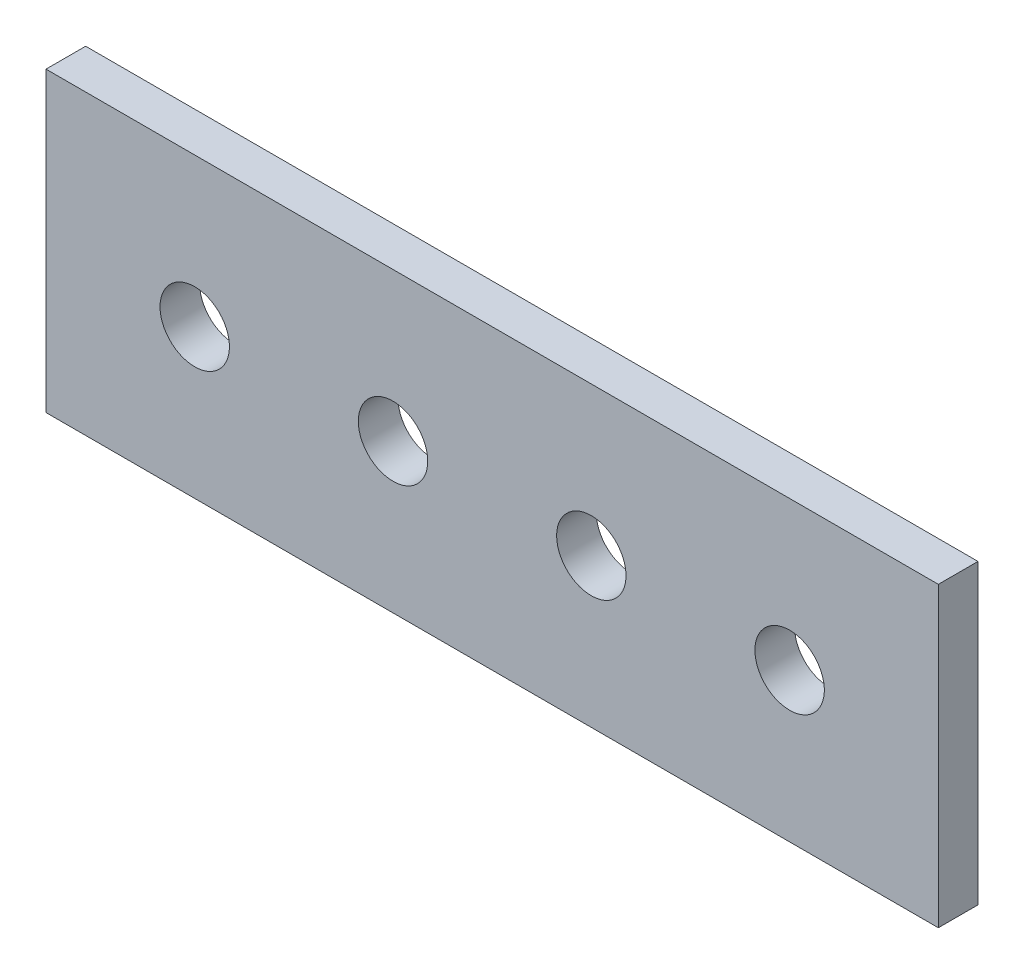
ISO-10303-21;
HEADER;
FILE_DESCRIPTION(('STEP AP214'),'2;1');
FILE_NAME('part.step','',(''),(''),'','','');
FILE_SCHEMA(('AUTOMOTIVE_DESIGN { 1 0 10303 214 1 1 1 1 }'));
ENDSEC;
DATA;
#1=APPLICATION_CONTEXT('core data for automotive mechanical design processes');
#2=APPLICATION_PROTOCOL_DEFINITION('international standard','automotive_design',2000,#1);
#3=PRODUCT_CONTEXT('',#1,'mechanical');
#4=PRODUCT('Part','Part','',(#3));
#5=PRODUCT_RELATED_PRODUCT_CATEGORY('part','',(#4));
#6=PRODUCT_DEFINITION_FORMATION('','',#4);
#7=PRODUCT_DEFINITION_CONTEXT('part definition',#1,'design');
#8=PRODUCT_DEFINITION('design','',#6,#7);
#9=PRODUCT_DEFINITION_SHAPE('','',#8);
#10=(LENGTH_UNIT() NAMED_UNIT(*) SI_UNIT(.MILLI.,.METRE.));
#11=(NAMED_UNIT(*) PLANE_ANGLE_UNIT() SI_UNIT($,.RADIAN.));
#12=(NAMED_UNIT(*) SI_UNIT($,.STERADIAN.) SOLID_ANGLE_UNIT());
#13=UNCERTAINTY_MEASURE_WITH_UNIT(LENGTH_MEASURE(1.E-05),#10,'distance_accuracy_value','');
#14=(GEOMETRIC_REPRESENTATION_CONTEXT(3) GLOBAL_UNCERTAINTY_ASSIGNED_CONTEXT((#13)) GLOBAL_UNIT_ASSIGNED_CONTEXT((#10,
#11,#12)) REPRESENTATION_CONTEXT('',''));
#15=CARTESIAN_POINT('',(0.,0.,0.));
#16=DIRECTION('',(0.,0.,1.));
#17=DIRECTION('',(1.,0.,0.));
#18=AXIS2_PLACEMENT_3D('',#15,#16,#17);
#19=CARTESIAN_POINT('',(-65.1327433628319,0.,-44.0132743362832));
#20=DIRECTION('',(-1.,0.,0.));
#21=DIRECTION('',(0.,0.,1.));
#22=AXIS2_PLACEMENT_3D('',#19,#20,#21);
#23=PLANE('',#22);
#24=DIRECTION('',(0.,-1.,0.));
#25=VECTOR('',#24,1.);
#26=CARTESIAN_POINT('',(-65.1327433628319,0.,-42.0132743362832));
#27=LINE('',#26,#25);
#28=CARTESIAN_POINT('',(-65.1327433628319,47.1391179720463,-42.0132743362832));
#29=VERTEX_POINT('',#28);
#30=CARTESIAN_POINT('',(-65.1327433628319,32.1391179720463,-42.0132743362832));
#31=VERTEX_POINT('',#30);
#32=EDGE_CURVE('E123',#29,#31,#27,.T.);
#33=ORIENTED_EDGE('',*,*,#32,.F.);
#34=DIRECTION('',(0.,0.,1.));
#35=VECTOR('',#34,1.);
#36=CARTESIAN_POINT('',(-65.1327433628319,47.1391179720463,-44.0132743362832));
#37=LINE('',#36,#35);
#38=CARTESIAN_POINT('',(-65.1327433628319,47.1391179720463,-44.0132743362832));
#39=VERTEX_POINT('',#38);
#40=EDGE_CURVE('E11',#39,#29,#37,.T.);
#41=ORIENTED_EDGE('',*,*,#40,.F.);
#42=DIRECTION('',(0.,-1.,0.));
#43=VECTOR('',#42,1.);
#44=CARTESIAN_POINT('',(-65.1327433628319,0.,-44.0132743362832));
#45=LINE('',#44,#43);
#46=CARTESIAN_POINT('',(-65.1327433628319,32.1391179720463,-44.0132743362832));
#47=VERTEX_POINT('',#46);
#48=EDGE_CURVE('E104',#39,#47,#45,.T.);
#49=ORIENTED_EDGE('',*,*,#48,.T.);
#50=DIRECTION('',(0.,0.,1.));
#51=VECTOR('',#50,1.);
#52=CARTESIAN_POINT('',(-65.1327433628319,32.1391179720463,-44.0132743362832));
#53=LINE('',#52,#51);
#54=EDGE_CURVE('E83',#47,#31,#53,.T.);
#55=ORIENTED_EDGE('',*,*,#54,.T.);
#56=EDGE_LOOP('',(#33,#41,#49,#55));
#57=FACE_BOUND('',#56,.T.);
#58=ADVANCED_FACE('F43',(#57),#23,.T.);
#59=CARTESIAN_POINT('',(0.,47.1391179720463,-44.0132743362832));
#60=DIRECTION('',(0.,1.,0.));
#61=DIRECTION('',(0.,0.,1.));
#62=AXIS2_PLACEMENT_3D('',#59,#60,#61);
#63=PLANE('',#62);
#64=DIRECTION('',(-1.,0.,0.));
#65=VECTOR('',#64,1.);
#66=CARTESIAN_POINT('',(0.,47.1391179720463,-42.0132743362832));
#67=LINE('',#66,#65);
#68=CARTESIAN_POINT('',(-20.1327433628319,47.1391179720463,-42.0132743362832));
#69=VERTEX_POINT('',#68);
#70=EDGE_CURVE('E95',#69,#29,#67,.T.);
#71=ORIENTED_EDGE('',*,*,#70,.F.);
#72=DIRECTION('',(0.,0.,1.));
#73=VECTOR('',#72,1.);
#74=CARTESIAN_POINT('',(-20.1327433628319,47.1391179720463,-44.0132743362832));
#75=LINE('',#74,#73);
#76=CARTESIAN_POINT('',(-20.1327433628319,47.1391179720463,-44.0132743362832));
#77=VERTEX_POINT('',#76);
#78=EDGE_CURVE('E52',#77,#69,#75,.T.);
#79=ORIENTED_EDGE('',*,*,#78,.F.);
#80=DIRECTION('',(-1.,0.,0.));
#81=VECTOR('',#80,1.);
#82=CARTESIAN_POINT('',(0.,47.1391179720463,-44.0132743362832));
#83=LINE('',#82,#81);
#84=EDGE_CURVE('E93',#77,#39,#83,.T.);
#85=ORIENTED_EDGE('',*,*,#84,.T.);
#86=ORIENTED_EDGE('',*,*,#40,.T.);
#87=EDGE_LOOP('',(#71,#79,#85,#86));
#88=FACE_BOUND('',#87,.T.);
#89=ADVANCED_FACE('F91',(#88),#63,.T.);
#90=CARTESIAN_POINT('',(-20.1327433628319,0.,-44.0132743362832));
#91=DIRECTION('',(-1.,0.,0.));
#92=DIRECTION('',(0.,-1.,0.));
#93=AXIS2_PLACEMENT_3D('',#90,#91,#92);
#94=PLANE('',#93);
#95=DIRECTION('',(0.,-1.,0.));
#96=VECTOR('',#95,1.);
#97=CARTESIAN_POINT('',(-20.1327433628319,0.,-42.0132743362832));
#98=LINE('',#97,#96);
#99=CARTESIAN_POINT('',(-20.1327433628319,32.1391179720463,-42.0132743362832));
#100=VERTEX_POINT('',#99);
#101=EDGE_CURVE('E126',#69,#100,#98,.T.);
#102=ORIENTED_EDGE('',*,*,#101,.T.);
#103=DIRECTION('',(0.,0.,1.));
#104=VECTOR('',#103,1.);
#105=CARTESIAN_POINT('',(-20.1327433628319,32.1391179720463,-44.0132743362832));
#106=LINE('',#105,#104);
#107=CARTESIAN_POINT('',(-20.1327433628319,32.1391179720463,-44.0132743362832));
#108=VERTEX_POINT('',#107);
#109=EDGE_CURVE('E98',#108,#100,#106,.T.);
#110=ORIENTED_EDGE('',*,*,#109,.F.);
#111=DIRECTION('',(0.,-1.,0.));
#112=VECTOR('',#111,1.);
#113=CARTESIAN_POINT('',(-20.1327433628319,0.,-44.0132743362832));
#114=LINE('',#113,#112);
#115=EDGE_CURVE('E100',#77,#108,#114,.T.);
#116=ORIENTED_EDGE('',*,*,#115,.F.);
#117=ORIENTED_EDGE('',*,*,#78,.T.);
#118=EDGE_LOOP('',(#102,#110,#116,#117));
#119=FACE_BOUND('',#118,.T.);
#120=ADVANCED_FACE('F101',(#119),#94,.F.);
#121=CARTESIAN_POINT('',(-27.6327433628319,39.6391179720463,-44.0132743362832));
#122=DIRECTION('',(0.,0.,1.));
#123=DIRECTION('',(1.,0.,0.));
#124=AXIS2_PLACEMENT_3D('',#121,#122,#123);
#125=CYLINDRICAL_SURFACE('',#124,1.75);
#126=CARTESIAN_POINT('',(-27.6327433628319,39.6391179720463,-44.0132743362832));
#127=DIRECTION('',(0.,0.,-1.));
#128=DIRECTION('',(-1.,0.,0.));
#129=AXIS2_PLACEMENT_3D('',#126,#127,#128);
#130=CIRCLE('',#129,1.75);
#131=CARTESIAN_POINT('',(-29.3827433628319,39.6391179720463,-44.0132743362832));
#132=VERTEX_POINT('',#131);
#133=EDGE_CURVE('E106',#132,#132,#130,.T.);
#134=ORIENTED_EDGE('',*,*,#133,.T.);
#135=EDGE_LOOP('',(#134));
#136=FACE_BOUND('',#135,.T.);
#137=CARTESIAN_POINT('',(-27.6327433628319,39.6391179720463,-42.0132743362832));
#138=DIRECTION('',(0.,0.,-1.));
#139=DIRECTION('',(-1.,0.,0.));
#140=AXIS2_PLACEMENT_3D('',#137,#138,#139);
#141=CIRCLE('',#140,1.75);
#142=CARTESIAN_POINT('',(-29.3827433628319,39.6391179720463,-42.0132743362832));
#143=VERTEX_POINT('',#142);
#144=EDGE_CURVE('E120',#143,#143,#141,.T.);
#145=ORIENTED_EDGE('',*,*,#144,.F.);
#146=EDGE_LOOP('',(#145));
#147=FACE_BOUND('',#146,.T.);
#148=ADVANCED_FACE('F143',(#136,#147),#125,.F.);
#149=CARTESIAN_POINT('',(-47.6327433628319,39.6391179720463,-44.0132743362832));
#150=DIRECTION('',(0.,0.,1.));
#151=DIRECTION('',(1.,0.,0.));
#152=AXIS2_PLACEMENT_3D('',#149,#150,#151);
#153=CYLINDRICAL_SURFACE('',#152,1.75);
#154=CARTESIAN_POINT('',(-47.6327433628319,39.6391179720463,-44.0132743362832));
#155=DIRECTION('',(0.,0.,-1.));
#156=DIRECTION('',(-1.,0.,0.));
#157=AXIS2_PLACEMENT_3D('',#154,#155,#156);
#158=CIRCLE('',#157,1.75);
#159=CARTESIAN_POINT('',(-49.3827433628319,39.6391179720463,-44.0132743362832));
#160=VERTEX_POINT('',#159);
#161=EDGE_CURVE('E242',#160,#160,#158,.T.);
#162=ORIENTED_EDGE('',*,*,#161,.T.);
#163=EDGE_LOOP('',(#162));
#164=FACE_BOUND('',#163,.T.);
#165=CARTESIAN_POINT('',(-47.6327433628319,39.6391179720463,-42.0132743362832));
#166=DIRECTION('',(0.,0.,-1.));
#167=DIRECTION('',(-1.,0.,0.));
#168=AXIS2_PLACEMENT_3D('',#165,#166,#167);
#169=CIRCLE('',#168,1.75);
#170=CARTESIAN_POINT('',(-49.3827433628319,39.6391179720463,-42.0132743362832));
#171=VERTEX_POINT('',#170);
#172=EDGE_CURVE('E117',#171,#171,#169,.T.);
#173=ORIENTED_EDGE('',*,*,#172,.F.);
#174=EDGE_LOOP('',(#173));
#175=FACE_BOUND('',#174,.T.);
#176=ADVANCED_FACE('F146',(#164,#175),#153,.F.);
#177=CARTESIAN_POINT('',(-57.6327433628319,39.6391179720463,-44.0132743362832));
#178=DIRECTION('',(0.,0.,1.));
#179=DIRECTION('',(1.,0.,0.));
#180=AXIS2_PLACEMENT_3D('',#177,#178,#179);
#181=CYLINDRICAL_SURFACE('',#180,1.75);
#182=CARTESIAN_POINT('',(-57.6327433628319,39.6391179720463,-44.0132743362832));
#183=DIRECTION('',(0.,0.,-1.));
#184=DIRECTION('',(-1.,0.,0.));
#185=AXIS2_PLACEMENT_3D('',#182,#183,#184);
#186=CIRCLE('',#185,1.75);
#187=CARTESIAN_POINT('',(-59.3827433628319,39.6391179720463,-44.0132743362832));
#188=VERTEX_POINT('',#187);
#189=EDGE_CURVE('E161',#188,#188,#186,.T.);
#190=ORIENTED_EDGE('',*,*,#189,.T.);
#191=EDGE_LOOP('',(#190));
#192=FACE_BOUND('',#191,.T.);
#193=CARTESIAN_POINT('',(-57.6327433628319,39.6391179720463,-42.0132743362832));
#194=DIRECTION('',(0.,0.,-1.));
#195=DIRECTION('',(-1.,0.,0.));
#196=AXIS2_PLACEMENT_3D('',#193,#194,#195);
#197=CIRCLE('',#196,1.75);
#198=CARTESIAN_POINT('',(-59.3827433628319,39.6391179720463,-42.0132743362832));
#199=VERTEX_POINT('',#198);
#200=EDGE_CURVE('E114',#199,#199,#197,.T.);
#201=ORIENTED_EDGE('',*,*,#200,.F.);
#202=EDGE_LOOP('',(#201));
#203=FACE_BOUND('',#202,.T.);
#204=ADVANCED_FACE('F149',(#192,#203),#181,.F.);
#205=CARTESIAN_POINT('',(-37.6327433628319,39.6391179720463,-44.0132743362832));
#206=DIRECTION('',(0.,0.,1.));
#207=DIRECTION('',(1.,0.,0.));
#208=AXIS2_PLACEMENT_3D('',#205,#206,#207);
#209=CYLINDRICAL_SURFACE('',#208,1.75);
#210=CARTESIAN_POINT('',(-37.6327433628319,39.6391179720463,-44.0132743362832));
#211=DIRECTION('',(0.,0.,-1.));
#212=DIRECTION('',(-1.,0.,0.));
#213=AXIS2_PLACEMENT_3D('',#210,#211,#212);
#214=CIRCLE('',#213,1.75);
#215=CARTESIAN_POINT('',(-39.3827433628319,39.6391179720463,-44.0132743362832));
#216=VERTEX_POINT('',#215);
#217=EDGE_CURVE('E129',#216,#216,#214,.T.);
#218=ORIENTED_EDGE('',*,*,#217,.T.);
#219=EDGE_LOOP('',(#218));
#220=FACE_BOUND('',#219,.T.);
#221=CARTESIAN_POINT('',(-37.6327433628319,39.6391179720463,-42.0132743362832));
#222=DIRECTION('',(0.,0.,-1.));
#223=DIRECTION('',(-1.,0.,0.));
#224=AXIS2_PLACEMENT_3D('',#221,#222,#223);
#225=CIRCLE('',#224,1.75);
#226=CARTESIAN_POINT('',(-39.3827433628319,39.6391179720463,-42.0132743362832));
#227=VERTEX_POINT('',#226);
#228=EDGE_CURVE('E111',#227,#227,#225,.T.);
#229=ORIENTED_EDGE('',*,*,#228,.F.);
#230=EDGE_LOOP('',(#229));
#231=FACE_BOUND('',#230,.T.);
#232=ADVANCED_FACE('F45',(#220,#231),#209,.F.);
#233=CARTESIAN_POINT('',(0.,32.1391179720463,-44.0132743362832));
#234=DIRECTION('',(0.,1.,0.));
#235=DIRECTION('',(0.,0.,1.));
#236=AXIS2_PLACEMENT_3D('',#233,#234,#235);
#237=PLANE('',#236);
#238=DIRECTION('',(-1.,0.,0.));
#239=VECTOR('',#238,1.);
#240=CARTESIAN_POINT('',(0.,32.1391179720463,-42.0132743362832));
#241=LINE('',#240,#239);
#242=EDGE_CURVE('E76',#100,#31,#241,.T.);
#243=ORIENTED_EDGE('',*,*,#242,.T.);
#244=ORIENTED_EDGE('',*,*,#54,.F.);
#245=DIRECTION('',(-1.,0.,0.));
#246=VECTOR('',#245,1.);
#247=CARTESIAN_POINT('',(0.,32.1391179720463,-44.0132743362832));
#248=LINE('',#247,#246);
#249=EDGE_CURVE('E60',#108,#47,#248,.T.);
#250=ORIENTED_EDGE('',*,*,#249,.F.);
#251=ORIENTED_EDGE('',*,*,#109,.T.);
#252=EDGE_LOOP('',(#243,#244,#250,#251));
#253=FACE_BOUND('',#252,.T.);
#254=ADVANCED_FACE('F132',(#253),#237,.F.);
#255=CARTESIAN_POINT('',(0.,0.,-44.0132743362832));
#256=DIRECTION('',(0.,0.,-1.));
#257=DIRECTION('',(-1.,0.,0.));
#258=AXIS2_PLACEMENT_3D('',#255,#256,#257);
#259=PLANE('',#258);
#260=ORIENTED_EDGE('',*,*,#217,.F.);
#261=EDGE_LOOP('',(#260));
#262=FACE_BOUND('',#261,.T.);
#263=ORIENTED_EDGE('',*,*,#189,.F.);
#264=EDGE_LOOP('',(#263));
#265=FACE_BOUND('',#264,.T.);
#266=ORIENTED_EDGE('',*,*,#161,.F.);
#267=EDGE_LOOP('',(#266));
#268=FACE_BOUND('',#267,.T.);
#269=ORIENTED_EDGE('',*,*,#133,.F.);
#270=EDGE_LOOP('',(#269));
#271=FACE_BOUND('',#270,.T.);
#272=ORIENTED_EDGE('',*,*,#48,.F.);
#273=ORIENTED_EDGE('',*,*,#84,.F.);
#274=ORIENTED_EDGE('',*,*,#115,.T.);
#275=ORIENTED_EDGE('',*,*,#249,.T.);
#276=EDGE_LOOP('',(#272,#273,#274,#275));
#277=FACE_BOUND('',#276,.T.);
#278=ADVANCED_FACE('F103',(#262,#265,#268,#271,#277),#259,.T.);
#279=CARTESIAN_POINT('',(0.,0.,-42.0132743362832));
#280=DIRECTION('',(0.,0.,-1.));
#281=DIRECTION('',(-1.,0.,0.));
#282=AXIS2_PLACEMENT_3D('',#279,#280,#281);
#283=PLANE('',#282);
#284=ORIENTED_EDGE('',*,*,#228,.T.);
#285=EDGE_LOOP('',(#284));
#286=FACE_BOUND('',#285,.T.);
#287=ORIENTED_EDGE('',*,*,#200,.T.);
#288=EDGE_LOOP('',(#287));
#289=FACE_BOUND('',#288,.T.);
#290=ORIENTED_EDGE('',*,*,#172,.T.);
#291=EDGE_LOOP('',(#290));
#292=FACE_BOUND('',#291,.T.);
#293=ORIENTED_EDGE('',*,*,#144,.T.);
#294=EDGE_LOOP('',(#293));
#295=FACE_BOUND('',#294,.T.);
#296=ORIENTED_EDGE('',*,*,#32,.T.);
#297=ORIENTED_EDGE('',*,*,#242,.F.);
#298=ORIENTED_EDGE('',*,*,#101,.F.);
#299=ORIENTED_EDGE('',*,*,#70,.T.);
#300=EDGE_LOOP('',(#296,#297,#298,#299));
#301=FACE_BOUND('',#300,.T.);
#302=ADVANCED_FACE('F133',(#286,#289,#292,#295,#301),#283,.F.);
#303=CLOSED_SHELL('',(#58,#89,#120,#148,#176,#204,#232,#254,#278,#302));
#304=MANIFOLD_SOLID_BREP('B2',#303);
#305=ADVANCED_BREP_SHAPE_REPRESENTATION('',(#18,#304),#14);
#306=SHAPE_DEFINITION_REPRESENTATION(#9,#305);
ENDSEC;
END-ISO-10303-21;
